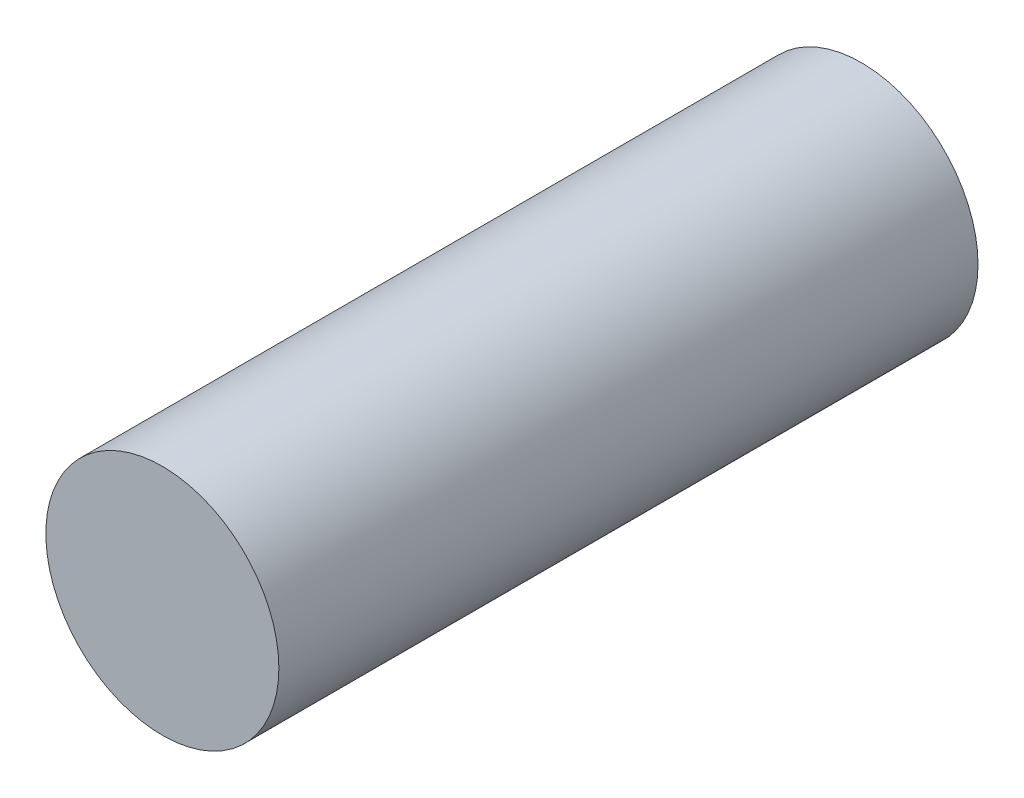
ISO-10303-21;
HEADER;
FILE_DESCRIPTION(('STEP AP214'),'2;1');
FILE_NAME('part.step','',(''),(''),'','','');
FILE_SCHEMA(('AUTOMOTIVE_DESIGN { 1 0 10303 214 1 1 1 1 }'));
ENDSEC;
DATA;
#1=APPLICATION_CONTEXT('core data for automotive mechanical design processes');
#2=APPLICATION_PROTOCOL_DEFINITION('international standard','automotive_design',2000,#1);
#3=PRODUCT_CONTEXT('',#1,'mechanical');
#4=PRODUCT('Part','Part','',(#3));
#5=PRODUCT_RELATED_PRODUCT_CATEGORY('part','',(#4));
#6=PRODUCT_DEFINITION_FORMATION('','',#4);
#7=PRODUCT_DEFINITION_CONTEXT('part definition',#1,'design');
#8=PRODUCT_DEFINITION('design','',#6,#7);
#9=PRODUCT_DEFINITION_SHAPE('','',#8);
#10=(LENGTH_UNIT() NAMED_UNIT(*) SI_UNIT(.MILLI.,.METRE.));
#11=(NAMED_UNIT(*) PLANE_ANGLE_UNIT() SI_UNIT($,.RADIAN.));
#12=(NAMED_UNIT(*) SI_UNIT($,.STERADIAN.) SOLID_ANGLE_UNIT());
#13=UNCERTAINTY_MEASURE_WITH_UNIT(LENGTH_MEASURE(1.E-05),#10,'distance_accuracy_value','');
#14=(GEOMETRIC_REPRESENTATION_CONTEXT(3) GLOBAL_UNCERTAINTY_ASSIGNED_CONTEXT((#13)) GLOBAL_UNIT_ASSIGNED_CONTEXT((#10,
#11,#12)) REPRESENTATION_CONTEXT('',''));
#15=CARTESIAN_POINT('',(0.,0.,0.));
#16=DIRECTION('',(0.,0.,1.));
#17=DIRECTION('',(1.,0.,0.));
#18=AXIS2_PLACEMENT_3D('',#15,#16,#17);
#19=CARTESIAN_POINT('',(0.,0.,150.));
#20=DIRECTION('',(0.,0.,-1.));
#21=DIRECTION('',(-1.,0.,0.));
#22=AXIS2_PLACEMENT_3D('',#19,#20,#21);
#23=CYLINDRICAL_SURFACE('',#22,25.);
#24=CARTESIAN_POINT('',(0.,0.,150.));
#25=DIRECTION('',(0.,0.,1.));
#26=DIRECTION('',(1.,0.,0.));
#27=AXIS2_PLACEMENT_3D('',#24,#25,#26);
#28=CIRCLE('',#27,25.);
#29=CARTESIAN_POINT('',(25.,0.,150.));
#30=VERTEX_POINT('',#29);
#31=EDGE_CURVE('E11',#30,#30,#28,.T.);
#32=ORIENTED_EDGE('',*,*,#31,.F.);
#33=EDGE_LOOP('',(#32));
#34=FACE_BOUND('',#33,.T.);
#35=CARTESIAN_POINT('',(0.,0.,0.));
#36=DIRECTION('',(0.,0.,1.));
#37=DIRECTION('',(1.,0.,0.));
#38=AXIS2_PLACEMENT_3D('',#35,#36,#37);
#39=CIRCLE('',#38,25.);
#40=CARTESIAN_POINT('',(25.,0.,0.));
#41=VERTEX_POINT('',#40);
#42=EDGE_CURVE('E40',#41,#41,#39,.T.);
#43=ORIENTED_EDGE('',*,*,#42,.T.);
#44=EDGE_LOOP('',(#43));
#45=FACE_BOUND('',#44,.T.);
#46=ADVANCED_FACE('F37',(#34,#45),#23,.T.);
#47=CARTESIAN_POINT('',(0.,0.,150.));
#48=DIRECTION('',(0.,0.,1.));
#49=DIRECTION('',(1.,0.,0.));
#50=AXIS2_PLACEMENT_3D('',#47,#48,#49);
#51=PLANE('',#50);
#52=ORIENTED_EDGE('',*,*,#31,.T.);
#53=EDGE_LOOP('',(#52));
#54=FACE_BOUND('',#53,.T.);
#55=ADVANCED_FACE('F129',(#54),#51,.T.);
#56=CARTESIAN_POINT('',(0.,0.,0.));
#57=DIRECTION('',(0.,0.,1.));
#58=DIRECTION('',(1.,0.,0.));
#59=AXIS2_PLACEMENT_3D('',#56,#57,#58);
#60=PLANE('',#59);
#61=DIRECTION('',(-1.,0.,0.));
#62=VECTOR('',#61,1.);
#63=CARTESIAN_POINT('',(-3.79427200333907,-9.19230846169722,0.));
#64=LINE('',#63,#62);
#65=CARTESIAN_POINT('',(-3.79427200333907,-9.19230846169722,0.));
#66=VERTEX_POINT('',#65);
#67=CARTESIAN_POINT('',(-6.84533608849833,-9.19230846169722,0.));
#68=VERTEX_POINT('',#67);
#69=EDGE_CURVE('E86',#66,#68,#64,.T.);
#70=ORIENTED_EDGE('',*,*,#69,.F.);
#71=DIRECTION('',(0.,-1.,0.));
#72=VECTOR('',#71,1.);
#73=CARTESIAN_POINT('',(-3.79427200333907,7.39296297557871,0.));
#74=LINE('',#73,#72);
#75=CARTESIAN_POINT('',(-3.79427200333907,7.39296297557871,0.));
#76=VERTEX_POINT('',#75);
#77=EDGE_CURVE('E51',#76,#66,#74,.T.);
#78=ORIENTED_EDGE('',*,*,#77,.F.);
#79=DIRECTION('',(1.,0.,0.));
#80=VECTOR('',#79,1.);
#81=CARTESIAN_POINT('',(-3.79427200333907,7.39296297557871,0.));
#82=LINE('',#81,#80);
#83=CARTESIAN_POINT('',(-6.84533608849833,7.39296297557871,0.));
#84=VERTEX_POINT('',#83);
#85=EDGE_CURVE('E102',#84,#76,#82,.T.);
#86=ORIENTED_EDGE('',*,*,#85,.F.);
#87=DIRECTION('',(0.,1.,0.));
#88=VECTOR('',#87,1.);
#89=CARTESIAN_POINT('',(-6.84533608849833,7.39296297557871,0.));
#90=LINE('',#89,#88);
#91=EDGE_CURVE('E108',#68,#84,#90,.T.);
#92=ORIENTED_EDGE('',*,*,#91,.F.);
#93=EDGE_LOOP('',(#70,#78,#86,#92));
#94=FACE_BOUND('',#93,.T.);
#95=ORIENTED_EDGE('',*,*,#42,.F.);
#96=EDGE_LOOP('',(#95));
#97=FACE_BOUND('',#96,.T.);
#98=ADVANCED_FACE('F114',(#94,#97),#60,.F.);
#99=CARTESIAN_POINT('',(-3.79427200333907,7.39296297557871,6.));
#100=DIRECTION('',(1.,0.,0.));
#101=DIRECTION('',(0.,0.,-1.));
#102=AXIS2_PLACEMENT_3D('',#99,#100,#101);
#103=PLANE('',#102);
#104=ORIENTED_EDGE('',*,*,#77,.T.);
#105=DIRECTION('',(0.,0.,-1.));
#106=VECTOR('',#105,1.);
#107=CARTESIAN_POINT('',(-3.79427200333907,-9.19230846169722,6.));
#108=LINE('',#107,#106);
#109=CARTESIAN_POINT('',(-3.79427200333907,-9.19230846169722,6.));
#110=VERTEX_POINT('',#109);
#111=EDGE_CURVE('E74',#110,#66,#108,.T.);
#112=ORIENTED_EDGE('',*,*,#111,.F.);
#113=DIRECTION('',(0.,-1.,0.));
#114=VECTOR('',#113,1.);
#115=CARTESIAN_POINT('',(-3.79427200333907,7.39296297557871,6.));
#116=LINE('',#115,#114);
#117=CARTESIAN_POINT('',(-3.79427200333907,7.39296297557871,6.));
#118=VERTEX_POINT('',#117);
#119=EDGE_CURVE('E100',#118,#110,#116,.T.);
#120=ORIENTED_EDGE('',*,*,#119,.F.);
#121=DIRECTION('',(0.,0.,-1.));
#122=VECTOR('',#121,1.);
#123=CARTESIAN_POINT('',(-3.79427200333907,7.39296297557871,6.));
#124=LINE('',#123,#122);
#125=EDGE_CURVE('E59',#118,#76,#124,.T.);
#126=ORIENTED_EDGE('',*,*,#125,.T.);
#127=EDGE_LOOP('',(#104,#112,#120,#126));
#128=FACE_BOUND('',#127,.T.);
#129=ADVANCED_FACE('F119',(#128),#103,.F.);
#130=CARTESIAN_POINT('',(-3.79427200333907,7.39296297557871,6.));
#131=DIRECTION('',(0.,1.,0.));
#132=DIRECTION('',(0.,0.,1.));
#133=AXIS2_PLACEMENT_3D('',#130,#131,#132);
#134=PLANE('',#133);
#135=ORIENTED_EDGE('',*,*,#85,.T.);
#136=ORIENTED_EDGE('',*,*,#125,.F.);
#137=DIRECTION('',(1.,0.,0.));
#138=VECTOR('',#137,1.);
#139=CARTESIAN_POINT('',(-3.79427200333907,7.39296297557871,6.));
#140=LINE('',#139,#138);
#141=CARTESIAN_POINT('',(-6.84533608849833,7.39296297557871,6.));
#142=VERTEX_POINT('',#141);
#143=EDGE_CURVE('E97',#142,#118,#140,.T.);
#144=ORIENTED_EDGE('',*,*,#143,.F.);
#145=DIRECTION('',(0.,0.,-1.));
#146=VECTOR('',#145,1.);
#147=CARTESIAN_POINT('',(-6.84533608849833,7.39296297557871,6.));
#148=LINE('',#147,#146);
#149=EDGE_CURVE('E90',#142,#84,#148,.T.);
#150=ORIENTED_EDGE('',*,*,#149,.T.);
#151=EDGE_LOOP('',(#135,#136,#144,#150));
#152=FACE_BOUND('',#151,.T.);
#153=ADVANCED_FACE('F117',(#152),#134,.F.);
#154=CARTESIAN_POINT('',(-6.84533608849833,7.39296297557871,6.));
#155=DIRECTION('',(-1.,0.,0.));
#156=DIRECTION('',(0.,0.,1.));
#157=AXIS2_PLACEMENT_3D('',#154,#155,#156);
#158=PLANE('',#157);
#159=ORIENTED_EDGE('',*,*,#91,.T.);
#160=ORIENTED_EDGE('',*,*,#149,.F.);
#161=DIRECTION('',(0.,1.,0.));
#162=VECTOR('',#161,1.);
#163=CARTESIAN_POINT('',(-6.84533608849833,7.39296297557871,6.));
#164=LINE('',#163,#162);
#165=CARTESIAN_POINT('',(-6.84533608849833,-9.19230846169722,6.));
#166=VERTEX_POINT('',#165);
#167=EDGE_CURVE('E93',#166,#142,#164,.T.);
#168=ORIENTED_EDGE('',*,*,#167,.F.);
#169=DIRECTION('',(0.,0.,-1.));
#170=VECTOR('',#169,1.);
#171=CARTESIAN_POINT('',(-6.84533608849833,-9.19230846169722,6.));
#172=LINE('',#171,#170);
#173=EDGE_CURVE('E79',#166,#68,#172,.T.);
#174=ORIENTED_EDGE('',*,*,#173,.T.);
#175=EDGE_LOOP('',(#159,#160,#168,#174));
#176=FACE_BOUND('',#175,.T.);
#177=ADVANCED_FACE('F94',(#176),#158,.F.);
#178=CARTESIAN_POINT('',(-3.79427200333907,-9.19230846169722,6.));
#179=DIRECTION('',(0.,-1.,0.));
#180=DIRECTION('',(0.,0.,-1.));
#181=AXIS2_PLACEMENT_3D('',#178,#179,#180);
#182=PLANE('',#181);
#183=ORIENTED_EDGE('',*,*,#69,.T.);
#184=ORIENTED_EDGE('',*,*,#173,.F.);
#185=DIRECTION('',(-1.,0.,0.));
#186=VECTOR('',#185,1.);
#187=CARTESIAN_POINT('',(-3.79427200333907,-9.19230846169722,6.));
#188=LINE('',#187,#186);
#189=EDGE_CURVE('E83',#110,#166,#188,.T.);
#190=ORIENTED_EDGE('',*,*,#189,.F.);
#191=ORIENTED_EDGE('',*,*,#111,.T.);
#192=EDGE_LOOP('',(#183,#184,#190,#191));
#193=FACE_BOUND('',#192,.T.);
#194=ADVANCED_FACE('F81',(#193),#182,.F.);
#195=CARTESIAN_POINT('',(0.,0.,6.));
#196=DIRECTION('',(0.,0.,-1.));
#197=DIRECTION('',(-1.,0.,0.));
#198=AXIS2_PLACEMENT_3D('',#195,#196,#197);
#199=PLANE('',#198);
#200=ORIENTED_EDGE('',*,*,#119,.T.);
#201=ORIENTED_EDGE('',*,*,#189,.T.);
#202=ORIENTED_EDGE('',*,*,#167,.T.);
#203=ORIENTED_EDGE('',*,*,#143,.T.);
#204=EDGE_LOOP('',(#200,#201,#202,#203));
#205=FACE_BOUND('',#204,.T.);
#206=ADVANCED_FACE('F99',(#205),#199,.T.);
#207=CLOSED_SHELL('',(#46,#55,#98,#129,#153,#177,#194,#206));
#208=MANIFOLD_SOLID_BREP('B2',#207);
#209=ADVANCED_BREP_SHAPE_REPRESENTATION('',(#18,#208),#14);
#210=SHAPE_DEFINITION_REPRESENTATION(#9,#209);
ENDSEC;
END-ISO-10303-21;
